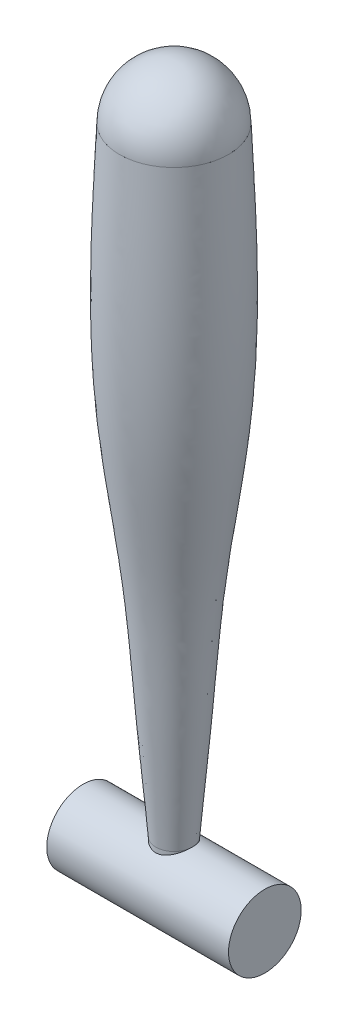
ISO-10303-21;
HEADER;
FILE_DESCRIPTION(('STEP AP214'),'2;1');
FILE_NAME('part.step','',(''),(''),'','','');
FILE_SCHEMA(('AUTOMOTIVE_DESIGN { 1 0 10303 214 1 1 1 1 }'));
ENDSEC;
DATA;
#1=APPLICATION_CONTEXT('core data for automotive mechanical design processes');
#2=APPLICATION_PROTOCOL_DEFINITION('international standard','automotive_design',2000,#1);
#3=PRODUCT_CONTEXT('',#1,'mechanical');
#4=PRODUCT('Part','Part','',(#3));
#5=PRODUCT_RELATED_PRODUCT_CATEGORY('part','',(#4));
#6=PRODUCT_DEFINITION_FORMATION('','',#4);
#7=PRODUCT_DEFINITION_CONTEXT('part definition',#1,'design');
#8=PRODUCT_DEFINITION('design','',#6,#7);
#9=PRODUCT_DEFINITION_SHAPE('','',#8);
#10=(LENGTH_UNIT() NAMED_UNIT(*) SI_UNIT(.MILLI.,.METRE.));
#11=(NAMED_UNIT(*) PLANE_ANGLE_UNIT() SI_UNIT($,.RADIAN.));
#12=(NAMED_UNIT(*) SI_UNIT($,.STERADIAN.) SOLID_ANGLE_UNIT());
#13=UNCERTAINTY_MEASURE_WITH_UNIT(LENGTH_MEASURE(1.E-05),#10,'distance_accuracy_value','');
#14=(GEOMETRIC_REPRESENTATION_CONTEXT(3) GLOBAL_UNCERTAINTY_ASSIGNED_CONTEXT((#13)) GLOBAL_UNIT_ASSIGNED_CONTEXT((#10,
#11,#12)) REPRESENTATION_CONTEXT('',''));
#15=CARTESIAN_POINT('',(0.,0.,0.));
#16=DIRECTION('',(0.,0.,1.));
#17=DIRECTION('',(1.,0.,0.));
#18=AXIS2_PLACEMENT_3D('',#15,#16,#17);
#19=CARTESIAN_POINT('',(0.,18.,0.));
#20=DIRECTION('',(0.,0.,-1.));
#21=DIRECTION('',(-1.,0.,0.));
#22=AXIS2_PLACEMENT_3D('',#19,#20,#21);
#23=SPHERICAL_SURFACE('',#22,1.5);
#24=CARTESIAN_POINT('',(0.,18.,0.));
#25=DIRECTION('',(0.,-1.,0.));
#26=DIRECTION('',(0.,0.,1.));
#27=AXIS2_PLACEMENT_3D('',#24,#25,#26);
#28=SPHERICAL_SURFACE('',#27,1.5);
#29=CARTESIAN_POINT('',(0.,18.,0.));
#30=DIRECTION('',(0.,-1.,0.));
#31=DIRECTION('',(0.,0.,1.));
#32=AXIS2_PLACEMENT_3D('',#29,#30,#31);
#33=CIRCLE('',#32,1.5);
#34=CARTESIAN_POINT('',(0.,18.,1.5));
#35=VERTEX_POINT('',#34);
#36=EDGE_CURVE('E12',#35,#35,#33,.T.);
#37=ORIENTED_EDGE('',*,*,#36,.F.);
#38=EDGE_LOOP('',(#37));
#39=FACE_BOUND('',#38,.T.);
#40=ADVANCED_FACE('F79',(#39),#28,.T.);
#41=CARTESIAN_POINT('',(0.,18.,0.));
#42=DIRECTION('',(0.,-1.,0.));
#43=DIRECTION('',(0.,0.,1.));
#44=AXIS2_PLACEMENT_3D('',#41,#42,#43);
#45=PLANE('',#44);
#46=ORIENTED_EDGE('',*,*,#36,.T.);
#47=EDGE_LOOP('',(#46));
#48=FACE_BOUND('',#47,.T.);
#49=ADVANCED_FACE('F86',(#48),#45,.T.);
#50=CLOSED_SHELL('',(#40,#49));
#51=MANIFOLD_SOLID_BREP('B2',#50);
#52=CARTESIAN_POINT('',(2.5,0.,0.));
#53=DIRECTION('',(-1.,0.,0.));
#54=DIRECTION('',(0.,0.,1.));
#55=AXIS2_PLACEMENT_3D('',#52,#53,#54);
#56=CYLINDRICAL_SURFACE('',#55,1.);
#57=CARTESIAN_POINT('',(0.,0.866025403784439,0.5));
#58=CARTESIAN_POINT('',(-0.0260539040974848,0.866027673641386,0.499998181537063));
#59=CARTESIAN_POINT('',(-0.0521407057624851,0.867219005938538,0.497949985366554));
#60=CARTESIAN_POINT('',(-0.103513632338614,0.871811832260507,0.489861604949081));
#61=CARTESIAN_POINT('',(-0.128797957521714,0.875217970277863,0.483813032277104));
#62=CARTESIAN_POINT('',(-0.177725832171961,0.883746733026927,0.468049974349892));
#63=CARTESIAN_POINT('',(-0.201377326236791,0.888860217366243,0.458354976246862));
#64=CARTESIAN_POINT('',(-0.246712100998363,0.900213324084306,0.43563376268819));
#65=CARTESIAN_POINT('',(-0.268395275131229,0.906453007380328,0.422607367017888));
#66=CARTESIAN_POINT('',(-0.311152864278752,0.919984345287202,0.392333270265438));
#67=CARTESIAN_POINT('',(-0.332029567836772,0.927320318189766,0.374826018071885));
#68=CARTESIAN_POINT('',(-0.370704194203355,0.94185991392853,0.336626903807234));
#69=CARTESIAN_POINT('',(-0.38850058129176,0.94906346915625,0.315933462891146));
#70=CARTESIAN_POINT('',(-0.421683575573831,0.963107384764745,0.270244781707273));
#71=CARTESIAN_POINT('',(-0.436826883929765,0.969890532090862,0.245053594506287));
#72=CARTESIAN_POINT('',(-0.462570426622881,0.981753780497645,0.192078513299752));
#73=CARTESIAN_POINT('',(-0.473173528068585,0.986834955918708,0.164296269069077));
#74=CARTESIAN_POINT('',(-0.488752330650549,0.994402306221187,0.109022471962988));
#75=CARTESIAN_POINT('',(-0.494074763177767,0.99704740110446,0.0816508952444086));
#76=CARTESIAN_POINT('',(-0.500083059337519,1.00003791923034,0.0262853143489239));
#77=CARTESIAN_POINT('',(-0.500771728397855,1.00038473392295,-0.00170830292186936));
#78=CARTESIAN_POINT('',(-0.497626663014825,0.998814909582251,-0.0549162622118751));
#79=CARTESIAN_POINT('',(-0.494180992239389,0.997092479460802,-0.0801605995883959));
#80=CARTESIAN_POINT('',(-0.483559578047671,0.991871226298737,-0.129656885959161));
#81=CARTESIAN_POINT('',(-0.476383555511888,0.988372270331969,-0.153908760546963));
#82=CARTESIAN_POINT('',(-0.458458716955093,0.979857916438272,-0.201154695784777));
#83=CARTESIAN_POINT('',(-0.447661843413966,0.974822207645996,-0.224126711757589));
#84=CARTESIAN_POINT('',(-0.422868291899253,0.963688229933436,-0.267988400756664));
#85=CARTESIAN_POINT('',(-0.408870468348825,0.95758958078742,-0.288877324419323));
#86=CARTESIAN_POINT('',(-0.376552324233492,0.944221971996146,-0.330086830449098));
#87=CARTESIAN_POINT('',(-0.357948485836995,0.936896879990875,-0.35016703751468));
#88=CARTESIAN_POINT('',(-0.317705137534912,0.922271702934058,-0.38705218514889));
#89=CARTESIAN_POINT('',(-0.296063313862969,0.914971641328144,-0.403854605787116));
#90=CARTESIAN_POINT('',(-0.248675903787956,0.900720780462423,-0.434752667321106));
#91=CARTESIAN_POINT('',(-0.222756988472894,0.893821599953538,-0.448608657489026));
#92=CARTESIAN_POINT('',(-0.168531164320501,0.881877251392879,-0.471659556500616));
#93=CARTESIAN_POINT('',(-0.140226783491219,0.876830150230337,-0.480859329105445));
#94=CARTESIAN_POINT('',(-0.0843927443586044,0.869723179085172,-0.49359010551252));
#95=CARTESIAN_POINT('',(-0.0569794404782237,0.867458279242482,-0.497512561059988));
#96=CARTESIAN_POINT('',(-0.00179932924172872,0.865589596808048,-0.500758473305713));
#97=CARTESIAN_POINT('',(0.0259672145598938,0.865983934446558,-0.500085178657513));
#98=CARTESIAN_POINT('',(0.0778269592893645,0.869171682702924,-0.494518021671983));
#99=CARTESIAN_POINT('',(0.101989725553964,0.871697937533271,-0.490093908356233));
#100=CARTESIAN_POINT('',(0.149183893135479,0.878470107756705,-0.47784814231622));
#101=CARTESIAN_POINT('',(0.172214925373305,0.882716580025169,-0.470025389311807));
#102=CARTESIAN_POINT('',(0.217705665451348,0.892681110398283,-0.450823794302443));
#103=CARTESIAN_POINT('',(0.240089508426776,0.898458216215316,-0.439297031846361));
#104=CARTESIAN_POINT('',(0.282734635769497,0.910780597486248,-0.413143532007902));
#105=CARTESIAN_POINT('',(0.302994821756642,0.917326266775738,-0.398515202166108));
#106=CARTESIAN_POINT('',(0.343489383761774,0.93143999228168,-0.364418583599427));
#107=CARTESIAN_POINT('',(0.363398575358829,0.939032915771447,-0.344572636157483));
#108=CARTESIAN_POINT('',(0.399706118996796,0.953671174889461,-0.301702247699145));
#109=CARTESIAN_POINT('',(0.416103285115271,0.960716325038539,-0.278676737327675));
#110=CARTESIAN_POINT('',(0.44528686297505,0.973706808454791,-0.229267681279377));
#111=CARTESIAN_POINT('',(0.457966559105451,0.979618208360172,-0.202811548787051));
#112=CARTESIAN_POINT('',(0.4785689519287,0.989416774796479,-0.147761182320547));
#113=CARTESIAN_POINT('',(0.486495825683168,0.993305718381767,-0.11916885069611));
#114=CARTESIAN_POINT('',(0.496684282087317,0.998337540909503,-0.0634898411651883));
#115=CARTESIAN_POINT('',(0.499398937938007,0.999699639541274,-0.0365057219251567));
#116=CARTESIAN_POINT('',(0.50042163272725,1.00021065187534,0.0175629929755308));
#117=CARTESIAN_POINT('',(0.498731214261966,0.999360340333266,0.0446475501472782));
#118=CARTESIAN_POINT('',(0.491291796602015,0.995669844190719,0.0962689961588217));
#119=CARTESIAN_POINT('',(0.485817575370541,0.992964473343949,0.120856158906529));
#120=CARTESIAN_POINT('',(0.471336500349138,0.985960468313117,0.168722976090912));
#121=CARTESIAN_POINT('',(0.462329139955595,0.981661605649085,0.192002442474414));
#122=CARTESIAN_POINT('',(0.440636473914593,0.97162965375613,0.237711703125926));
#123=CARTESIAN_POINT('',(0.427810338386869,0.965843086053095,0.260062571363279));
#124=CARTESIAN_POINT('',(0.39902103457969,0.953440665650003,0.30238732089375));
#125=CARTESIAN_POINT('',(0.383056425476612,0.946824432570784,0.322360103657879));
#126=CARTESIAN_POINT('',(0.346601430450362,0.932643051375993,0.361457002133394));
#127=CARTESIAN_POINT('',(0.325818756112608,0.925048996007109,0.380298842483295));
#128=CARTESIAN_POINT('',(0.281274639284436,0.910315381771854,0.414331643912887));
#129=CARTESIAN_POINT('',(0.257510589524545,0.903176229068854,0.429519375063788));
#130=CARTESIAN_POINT('',(0.206681676750853,0.889998026256437,0.456215539833051));
#131=CARTESIAN_POINT('',(0.179536234446345,0.884000871211844,0.467592532964975));
#132=CARTESIAN_POINT('',(0.123333797819433,0.87433078171103,0.485439354768648));
#133=CARTESIAN_POINT('',(0.0942835555420714,0.870650080748793,0.491925595589966));
#134=CARTESIAN_POINT('',(0.0540973221745788,0.867646363005208,0.497183503931373));
#135=CARTESIAN_POINT('',(0.0433160528012172,0.867040645024728,0.498238052481696));
#136=CARTESIAN_POINT('',(0.0216917596587195,0.866229679439781,0.499646702545211));
#137=CARTESIAN_POINT('',(0.0108487318070045,0.866024458625925,0.50000075720002));
#138=CARTESIAN_POINT('',(0.,0.866025403784439,0.5));
#139=B_SPLINE_CURVE_WITH_KNOTS('',3,(#57,#58,#59,#60,#61,#62,#63,#64,#65,#66,#67,#68,#69,#70,
#71,#72,#73,#74,#75,#76,#77,#78,#79,#80,#81,#82,#83,#84,#85,#86,#87,#88,#89,#90,#91,#92,#93,#94,
#95,#96,#97,#98,#99,#100,#101,#102,#103,#104,#105,#106,#107,#108,#109,#110,#111,#112,#113,#114,
#115,#116,#117,#118,#119,#120,#121,#122,#123,#124,#125,#126,#127,#128,#129,#130,#131,#132,#133,
#134,#135,#136,#137,#138),.UNSPECIFIED.,.T.,.F.,(4,2,2,2,2,2,2,2,2,2,2,2,2,2,2,2,2,2,2,2,2,2,2,
2,2,2,2,2,2,2,2,2,2,2,2,2,2,2,2,2,4),(0.,0.0781160612973578,0.156396446412402,0.234264297959443,
0.312136362722575,0.396431156249117,0.480767855421855,0.570789461193817,0.660754134819455,
0.744317424839676,0.8278301184302,0.904080487422692,0.980336562587276,1.05764767365573,
1.13498649675136,1.21963595728445,1.30435024122959,1.39444420864724,1.48444387105852,
1.56731145427106,1.65012046594187,1.72387091712013,1.79764526218032,1.87483648203044,
1.95206743110024,2.03903371790307,2.12602932489101,2.21532090706483,2.30453389904386,
2.38556135194743,2.46656043396986,2.54222212435746,2.61789466756007,2.69680375359736,
2.7757491505036,2.8625512092522,2.94942971422226,3.03905374518951,3.12837566501029,
3.16090067592303,3.19342786246919),.UNSPECIFIED.);
#140=CARTESIAN_POINT('',(0.500226375690061,1.,-2.58283320938398E-07));
#141=VERTEX_POINT('',#140);
#142=CARTESIAN_POINT('',(-0.500230723170608,1.,1.81845485200609E-07));
#143=VERTEX_POINT('',#142);
#144=EDGE_CURVE('E119',#141,#143,#139,.T.);
#145=ORIENTED_EDGE('',*,*,#144,.T.);
#146=EDGE_CURVE('E77',#143,#141,#139,.T.);
#147=ORIENTED_EDGE('',*,*,#146,.T.);
#148=EDGE_LOOP('',(#145,#147));
#149=FACE_BOUND('',#148,.T.);
#150=CARTESIAN_POINT('',(2.5,0.,0.));
#151=DIRECTION('',(1.,0.,0.));
#152=DIRECTION('',(0.,0.,-1.));
#153=AXIS2_PLACEMENT_3D('',#150,#151,#152);
#154=CIRCLE('',#153,1.);
#155=CARTESIAN_POINT('',(2.5,0.,-1.));
#156=VERTEX_POINT('',#155);
#157=EDGE_CURVE('E131',#156,#156,#154,.T.);
#158=ORIENTED_EDGE('',*,*,#157,.F.);
#159=EDGE_LOOP('',(#158));
#160=FACE_BOUND('',#159,.T.);
#161=CARTESIAN_POINT('',(-2.5,0.,0.));
#162=DIRECTION('',(1.,0.,0.));
#163=DIRECTION('',(0.,0.,-1.));
#164=AXIS2_PLACEMENT_3D('',#161,#162,#163);
#165=CIRCLE('',#164,1.);
#166=CARTESIAN_POINT('',(-2.5,0.,-1.));
#167=VERTEX_POINT('',#166);
#168=EDGE_CURVE('E146',#167,#167,#165,.T.);
#169=ORIENTED_EDGE('',*,*,#168,.T.);
#170=EDGE_LOOP('',(#169));
#171=FACE_BOUND('',#170,.T.);
#172=ADVANCED_FACE('F108',(#149,#160,#171),#56,.T.);
#173=CARTESIAN_POINT('',(2.5,0.,0.));
#174=DIRECTION('',(1.,0.,0.));
#175=DIRECTION('',(0.,0.,-1.));
#176=AXIS2_PLACEMENT_3D('',#173,#174,#175);
#177=PLANE('',#176);
#178=ORIENTED_EDGE('',*,*,#157,.T.);
#179=EDGE_LOOP('',(#178));
#180=FACE_BOUND('',#179,.T.);
#181=ADVANCED_FACE('F204',(#180),#177,.T.);
#182=CARTESIAN_POINT('',(-2.5,0.,0.));
#183=DIRECTION('',(1.,0.,0.));
#184=DIRECTION('',(0.,0.,-1.));
#185=AXIS2_PLACEMENT_3D('',#182,#183,#184);
#186=PLANE('',#185);
#187=ORIENTED_EDGE('',*,*,#168,.F.);
#188=EDGE_LOOP('',(#187));
#189=FACE_BOUND('',#188,.T.);
#190=ADVANCED_FACE('F208',(#189),#186,.F.);
#191=CARTESIAN_POINT('',(0.,0.5,0.));
#192=DIRECTION('',(0.,1.,0.));
#193=DIRECTION('',(0.,0.,1.));
#194=AXIS2_PLACEMENT_3D('',#191,#192,#193);
#195=CYLINDRICAL_SURFACE('',#194,0.5);
#196=ORIENTED_EDGE('',*,*,#146,.F.);
#197=CARTESIAN_POINT('',(0.016333375466762,1.,-0.499733149636746));
#198=CARTESIAN_POINT('',(-0.0490815368925963,1.,-0.501871183356276));
#199=CARTESIAN_POINT('',(-0.180615444446807,1.,-0.479214196349831));
#200=CARTESIAN_POINT('',(-0.40817112476593,1.,-0.340357973589659));
#201=CARTESIAN_POINT('',(-0.524965903704197,1.,-0.0824733312606903));
#202=CARTESIAN_POINT('',(-0.479424976799487,1.,0.180466121827359));
#203=CARTESIAN_POINT('',(-0.340256596115148,0.999999999999999,0.408141369305681));
#204=CARTESIAN_POINT('',(-0.0181128008898399,1.,0.554176144168253));
#205=CARTESIAN_POINT('',(0.312879335558989,0.999999999999999,0.429488591139217));
#206=CARTESIAN_POINT('',(0.466617580963594,1.,0.211386760801805));
#207=CARTESIAN_POINT('',(0.529230899843729,1.,-0.0480177578797267));
#208=CARTESIAN_POINT('',(0.429524902904911,0.999999999999999,-0.312978553679436));
#209=CARTESIAN_POINT('',(0.21152200105666,1.,-0.466397499805604));
#210=CARTESIAN_POINT('',(0.0817482878261203,1.,-0.497595115917215));
#211=CARTESIAN_POINT('',(0.016333375466762,1.,-0.499733149636746));
#212=B_SPLINE_CURVE_WITH_KNOTS('',3,(#197,#198,#199,#200,#201,#202,#203,#204,#205,#206,#207,
#208,#209,#210,#211),.UNSPECIFIED.,.T.,.F.,(4,1,1,1,1,1,1,1,1,1,1,1,4),(0.,0.0625,0.125,0.25,
0.3125,0.375,0.5,0.625,0.6875,0.75,0.875,0.9375,1.),.UNSPECIFIED.);
#213=EDGE_CURVE('E136',#141,#143,#212,.T.);
#214=ORIENTED_EDGE('',*,*,#213,.F.);
#215=EDGE_LOOP('',(#196,#214));
#216=FACE_BOUND('',#215,.T.);
#217=ADVANCED_FACE('F134',(#216),#195,.T.);
#218=ORIENTED_EDGE('',*,*,#144,.F.);
#219=CARTESIAN_POINT('',(0.016333375466762,1.,-0.499733149636746));
#220=CARTESIAN_POINT('',(-0.0490815368925963,1.,-0.501871183356276));
#221=CARTESIAN_POINT('',(-0.180615444446807,1.,-0.479214196349831));
#222=CARTESIAN_POINT('',(-0.40817112476593,1.,-0.340357973589659));
#223=CARTESIAN_POINT('',(-0.524965903704197,1.,-0.0824733312606903));
#224=CARTESIAN_POINT('',(-0.479424976799487,1.,0.180466121827359));
#225=CARTESIAN_POINT('',(-0.340256596115148,0.999999999999999,0.408141369305681));
#226=CARTESIAN_POINT('',(-0.0181128008898399,1.,0.554176144168253));
#227=CARTESIAN_POINT('',(0.312879335558989,0.999999999999999,0.429488591139217));
#228=CARTESIAN_POINT('',(0.466617580963594,1.,0.211386760801805));
#229=CARTESIAN_POINT('',(0.529230899843729,1.,-0.0480177578797267));
#230=CARTESIAN_POINT('',(0.429524902904911,0.999999999999999,-0.312978553679436));
#231=CARTESIAN_POINT('',(0.21152200105666,1.,-0.466397499805604));
#232=CARTESIAN_POINT('',(0.0817482878261203,1.,-0.497595115917215));
#233=CARTESIAN_POINT('',(0.016333375466762,1.,-0.499733149636746));
#234=B_SPLINE_CURVE_WITH_KNOTS('',3,(#219,#220,#221,#222,#223,#224,#225,#226,#227,#228,#229,
#230,#231,#232,#233),.UNSPECIFIED.,.T.,.F.,(4,1,1,1,1,1,1,1,1,1,1,1,4),(0.,0.0625,0.125,0.25,
0.3125,0.375,0.5,0.625,0.6875,0.75,0.875,0.9375,1.),.UNSPECIFIED.);
#235=EDGE_CURVE('E138',#143,#141,#234,.T.);
#236=ORIENTED_EDGE('',*,*,#235,.F.);
#237=EDGE_LOOP('',(#218,#236));
#238=FACE_BOUND('',#237,.T.);
#239=ADVANCED_FACE('F139',(#238),#195,.T.);
#240=CARTESIAN_POINT('',(0.,18.,0.));
#241=DIRECTION('',(0.,1.,0.));
#242=DIRECTION('',(0.,0.,1.));
#243=AXIS2_PLACEMENT_3D('',#240,#241,#242);
#244=PLANE('',#243);
#245=CARTESIAN_POINT('',(0.,18.,0.));
#246=DIRECTION('',(0.,1.,0.));
#247=DIRECTION('',(0.,0.,1.));
#248=AXIS2_PLACEMENT_3D('',#245,#246,#247);
#249=CIRCLE('',#248,1.5);
#250=CARTESIAN_POINT('',(0.,18.,1.5));
#251=VERTEX_POINT('',#250);
#252=EDGE_CURVE('E142',#251,#251,#249,.T.);
#253=ORIENTED_EDGE('',*,*,#252,.T.);
#254=EDGE_LOOP('',(#253));
#255=FACE_BOUND('',#254,.T.);
#256=ADVANCED_FACE('F171',(#255),#244,.T.);
#257=CARTESIAN_POINT('',(-0.090936023022156,18.,-1.49724100922895));
#258=CARTESIAN_POINT('',(-0.0902384591741256,15.6617412941167,-1.60379727622974));
#259=CARTESIAN_POINT('',(-0.0756675437052186,11.9700591521778,-1.77672235131619));
#260=CARTESIAN_POINT('',(-0.153384458716675,7.34431109764308,-0.963873606387254));
#261=CARTESIAN_POINT('',(-0.0812287548917015,3.99817167928486,-0.759968876464099));
#262=CARTESIAN_POINT('',(-0.0216441150526979,1.99982491581645,-0.581941065222013));
#263=CARTESIAN_POINT('',(0.016333375466762,1.,-0.499733149636746));
#264=CARTESIAN_POINT('',(0.105052354916635,18.,-1.50914450608647));
#265=CARTESIAN_POINT('',(0.119651157474479,15.6617422493218,-1.61560673448349));
#266=CARTESIAN_POINT('',(0.156918751517552,11.9700589046531,-1.78662836384834));
#267=CARTESIAN_POINT('',(-0.0272180534641265,7.34431112477419,-0.983950727258299));
#268=CARTESIAN_POINT('',(0.0182582367305116,3.99817169788031,-0.770603766455718));
#269=CARTESIAN_POINT('',(0.0545168482382324,1.9998248548878,-0.584769810818426));
#270=CARTESIAN_POINT('',(0.0817482878261203,1.,-0.497595115917215));
#271=CARTESIAN_POINT('',(0.500611979726599,18.,-1.45436038891512));
#272=CARTESIAN_POINT('',(0.542938687785509,15.6617281025992,-1.55533632914301));
#273=CARTESIAN_POINT('',(0.624207566546023,11.9700625488927,-1.7141446638105));
#274=CARTESIAN_POINT('',(0.233148621187535,7.34431076058919,-0.971678504536416));
#275=CARTESIAN_POINT('',(0.221214772553101,3.99817131986558,-0.751003552546951));
#276=CARTESIAN_POINT('',(0.207829698929866,1.99982598117208,-0.559071764679779));
#277=CARTESIAN_POINT('',(0.21152200105666,1.,-0.466397499805604));
#278=CARTESIAN_POINT('',(1.19581754544546,18.,-1.05316736979847));
#279=CARTESIAN_POINT('',(1.28570485057592,15.6617444248984,-1.12183291336343));
#280=CARTESIAN_POINT('',(1.44048001221659,11.9700582026007,-1.22175927417473));
#281=CARTESIAN_POINT('',(0.707189535090171,7.34431142708143,-0.75930050392081));
#282=CARTESIAN_POINT('',(0.58373869546142,3.99817108438654,-0.564713498222455));
#283=CARTESIAN_POINT('',(0.473534138644243,1.9998261473011,-0.398527187298515));
#284=CARTESIAN_POINT('',(0.429524902904911,0.999999999999999,-0.312978553679436));
#285=CARTESIAN_POINT('',(1.56695044221607,18.,-0.292495607892285));
#286=CARTESIAN_POINT('',(1.67932709480281,15.6617319825109,-0.305913089570786));
#287=CARTESIAN_POINT('',(1.86339611852676,11.9700617895484,-0.313651648690655));
#288=CARTESIAN_POINT('',(0.996821137396244,7.34431044283189,-0.2872737589333));
#289=CARTESIAN_POINT('',(0.791031281554482,3.99817256238603,-0.184985261720789));
#290=CARTESIAN_POINT('',(0.611015802448772,1.99982318709427,-0.0988170350899208));
#291=CARTESIAN_POINT('',(0.529230899843729,1.,-0.0480177578797267));
#292=CARTESIAN_POINT('',(1.45307917995388,18.,0.501325252950499));
#293=CARTESIAN_POINT('',(1.55371592841839,15.6617485412865,0.543835350341586));
#294=CARTESIAN_POINT('',(1.71178906344709,11.9700571484405,0.625573222882708));
#295=CARTESIAN_POINT('',(0.972426189745203,7.34431152220906,0.232680232924998));
#296=CARTESIAN_POINT('',(0.751189902904345,3.99817122394593,0.221090903218027));
#297=CARTESIAN_POINT('',(0.559313410057183,1.99982575505965,0.207669110923355));
#298=CARTESIAN_POINT('',(0.466617580963594,1.,0.211386760801805));
#299=CARTESIAN_POINT('',(1.05430618792867,18.,1.19545877403463));
#300=CARTESIAN_POINT('',(1.12331370912628,15.6617243653686,1.28522932088373));
#301=CARTESIAN_POINT('',(1.22401673672923,11.9700635612142,1.43970240171202));
#302=CARTESIAN_POINT('',(0.758340729977426,7.34431057811699,0.707581462776039));
#303=CARTESIAN_POINT('',(0.564541977416559,3.99817145523059,0.583857709169394));
#304=CARTESIAN_POINT('',(0.398368579975902,1.99982576539775,0.47357672445573));
#305=CARTESIAN_POINT('',(0.312879335558989,0.999999999999999,0.429488591139217));
#306=CARTESIAN_POINT('',(0.100838587388528,18.,1.66028448719425));
#307=CARTESIAN_POINT('',(0.100056665933211,15.6617484685056,1.77838034317839));
#308=CARTESIAN_POINT('',(0.0838728245838338,11.9700570795461,1.9699392242961));
#309=CARTESIAN_POINT('',(0.170151140211801,7.34431167276404,1.06931645832549));
#310=CARTESIAN_POINT('',(0.0900721015291394,3.99817080634933,0.842727421651941));
#311=CARTESIAN_POINT('',(0.0239993193936933,1.99982666788673,0.64532427032602));
#312=CARTESIAN_POINT('',(-0.0181128008898399,1.,0.554176144168253));
#313=CARTESIAN_POINT('',(-0.901876048381211,18.,1.3142689266955));
#314=CARTESIAN_POINT('',(-0.972051084013436,15.6617242804928,1.4031236249844));
#315=CARTESIAN_POINT('',(-1.09717427745183,11.9700636644939,1.53854652574574));
#316=CARTESIAN_POINT('',(-0.501243309778671,7.34431043433424,0.908014154324062));
#317=CARTESIAN_POINT('',(-0.428388021231282,3.99817183908018,0.689991611792192));
#318=CARTESIAN_POINT('',(-0.362088973907607,1.99982492957194,0.501853585483645));
#319=CARTESIAN_POINT('',(-0.340256596115148,0.999999999999999,0.408141369305681));
#320=CARTESIAN_POINT('',(-1.38172536301549,18.,0.673499171240066));
#321=CARTESIAN_POINT('',(-1.48289691548642,15.6617498938763,0.714696275720223));
#322=CARTESIAN_POINT('',(-1.65237304251413,11.9700567809959,0.768865764234669));
#323=CARTESIAN_POINT('',(-0.852151282006461,7.34431159009723,0.523040403151743));
#324=CARTESIAN_POINT('',(-0.687494336560265,3.99817116991696,0.374863193968216));
#325=CARTESIAN_POINT('',(-0.542342370391395,1.99982584414561,0.248642134809142));
#326=CARTESIAN_POINT('',(-0.479424976799487,1.,0.180466121827359));
#327=CARTESIAN_POINT('',(-1.59083179203132,18.,-0.100705404322883));
#328=CARTESIAN_POINT('',(-1.70306928106696,15.6617266921164,-0.115609868387841));
#329=CARTESIAN_POINT('',(-1.88342527911629,11.9700632008458,-0.154119171233181));
#330=CARTESIAN_POINT('',(-1.03680986617385,7.34431022233045,0.0363275466911718));
#331=CARTESIAN_POINT('',(-0.812254879521905,3.9981726509193,-0.0136195015056778));
#332=CARTESIAN_POINT('',(-0.616669242075028,1.99982310660459,-0.0531516332423134));
#333=CARTESIAN_POINT('',(-0.524965903704197,1.,-0.0824733312606903));
#334=CARTESIAN_POINT('',(-1.31448723545952,18.,-0.900702180866356));
#335=CARTESIAN_POINT('',(-1.40338947322351,15.6617514886292,-0.970518082456808));
#336=CARTESIAN_POINT('',(-1.53895512946628,11.9700562732769,-1.09481879871249));
#337=CARTESIAN_POINT('',(-0.907853490733966,7.34431179969018,-0.502271070222095));
#338=CARTESIAN_POINT('',(-0.689910874651083,3.99817075294892,-0.428575550928922));
#339=CARTESIAN_POINT('',(-0.501826847854513,1.99982672007573,-0.362259414082925));
#340=CARTESIAN_POINT('',(-0.40817112476593,1.,-0.340357973589659));
#341=CARTESIAN_POINT('',(-0.672946199296195,18.,-1.38308347829909));
#342=CARTESIAN_POINT('',(-0.714026923496168,15.661722371369,-1.48462365014966));
#343=CARTESIAN_POINT('',(-0.76786988862962,11.970064034041,-1.6549072060428));
#344=CARTESIAN_POINT('',(-0.523339222679941,7.34431059780253,-0.851321381404694));
#345=CARTESIAN_POINT('',(-0.374933741527177,3.99817120829287,-0.687280963292304));
#346=CARTESIAN_POINT('',(-0.248784052163034,1.99982634674397,-0.542087785328348));
#347=CARTESIAN_POINT('',(-0.180615444446807,1.,-0.479214196349831));
#348=CARTESIAN_POINT('',(-0.286924400960947,18.,-1.48533751237142));
#349=CARTESIAN_POINT('',(-0.30012807582273,15.6617403389117,-1.591987817976));
#350=CARTESIAN_POINT('',(-0.308253838927989,11.9700593997025,-1.76681633878404));
#351=CARTESIAN_POINT('',(-0.279550863969223,7.34431107051197,-0.943796485516209));
#352=CARTESIAN_POINT('',(-0.180715746513915,3.9981716606894,-0.749333986472481));
#353=CARTESIAN_POINT('',(-0.0978050783436282,1.9998249767451,-0.579112319625601));
#354=CARTESIAN_POINT('',(-0.0490815368925963,1.,-0.501871183356276));
#355=CARTESIAN_POINT('',(-0.090936023022156,18.,-1.49724100922895));
#356=CARTESIAN_POINT('',(-0.0902384591741256,15.6617412941167,-1.60379727622974));
#357=CARTESIAN_POINT('',(-0.0756675437052186,11.9700591521778,-1.77672235131619));
#358=CARTESIAN_POINT('',(-0.153384458716675,7.34431109764308,-0.963873606387254));
#359=CARTESIAN_POINT('',(-0.0812287548917015,3.99817167928486,-0.759968876464099));
#360=CARTESIAN_POINT('',(-0.0216441150526979,1.99982491581645,-0.581941065222013));
#361=CARTESIAN_POINT('',(0.016333375466762,1.,-0.499733149636746));
#362=B_SPLINE_SURFACE_WITH_KNOTS('',3,3,((#257,#258,#259,#260,#261,#262,#263),(#264,#265,#266,
#267,#268,#269,#270),(#271,#272,#273,#274,#275,#276,#277),(#278,#279,#280,#281,#282,#283,#284),
(#285,#286,#287,#288,#289,#290,#291),(#292,#293,#294,#295,#296,#297,#298),(#299,#300,#301,#302,
#303,#304,#305),(#306,#307,#308,#309,#310,#311,#312),(#313,#314,#315,#316,#317,#318,#319),(#320,
#321,#322,#323,#324,#325,#326),(#327,#328,#329,#330,#331,#332,#333),(#334,#335,#336,#337,#338,
#339,#340),(#341,#342,#343,#344,#345,#346,#347),(#348,#349,#350,#351,#352,#353,#354),(#355,#356,
#357,#358,#359,#360,#361)),.UNSPECIFIED.,.T.,.F.,.F.,(4,1,1,1,1,1,1,1,1,1,1,1,4),(4,1,1,1,4),
(0.,0.0625,0.125,0.25,0.3125,0.375,0.5,0.625,0.6875,0.75,0.875,0.9375,1.),(0.,0.410464226040604,
0.646881987541375,0.823410082508847,1.),.UNSPECIFIED.);
#363=ORIENTED_EDGE('',*,*,#252,.F.);
#364=EDGE_LOOP('',(#363));
#365=FACE_BOUND('',#364,.T.);
#366=ORIENTED_EDGE('',*,*,#235,.T.);
#367=ORIENTED_EDGE('',*,*,#213,.T.);
#368=EDGE_LOOP('',(#366,#367));
#369=FACE_BOUND('',#368,.T.);
#370=ADVANCED_FACE('F145',(#365,#369),#362,.T.);
#371=CLOSED_SHELL('',(#172,#181,#190,#217,#239,#256,#370));
#372=MANIFOLD_SOLID_BREP('B7',#371);
#373=ADVANCED_BREP_SHAPE_REPRESENTATION('',(#18,#51,#372),#14);
#374=SHAPE_DEFINITION_REPRESENTATION(#9,#373);
ENDSEC;
END-ISO-10303-21;
